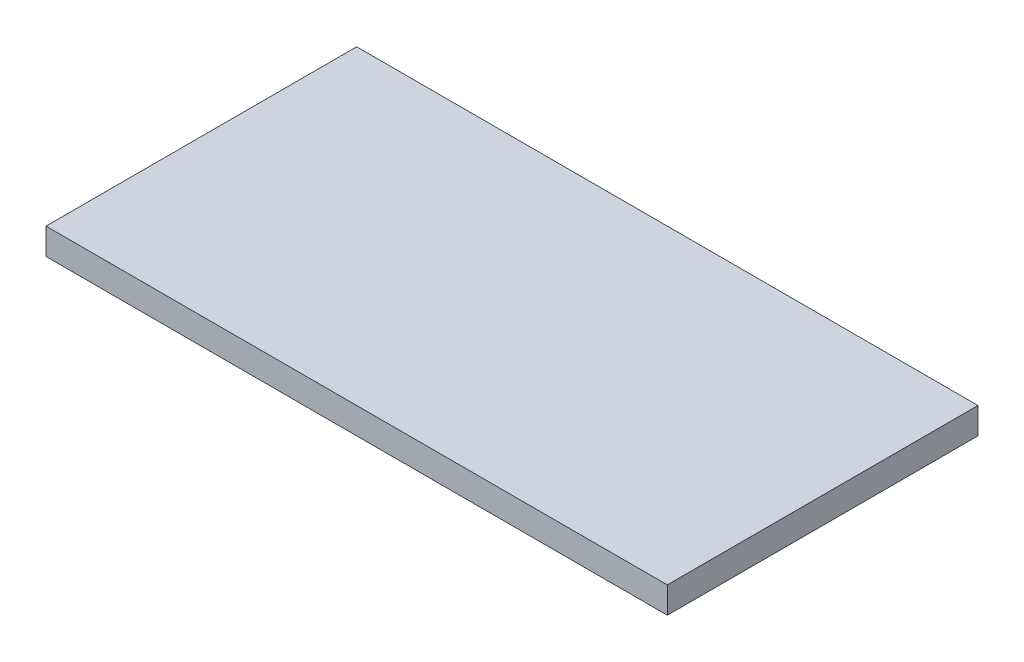
ISO-10303-21;
HEADER;
FILE_DESCRIPTION(('STEP AP214'),'2;1');
FILE_NAME('part.step','',(''),(''),'','','');
FILE_SCHEMA(('AUTOMOTIVE_DESIGN { 1 0 10303 214 1 1 1 1 }'));
ENDSEC;
DATA;
#1=APPLICATION_CONTEXT('core data for automotive mechanical design processes');
#2=APPLICATION_PROTOCOL_DEFINITION('international standard','automotive_design',2000,#1);
#3=PRODUCT_CONTEXT('',#1,'mechanical');
#4=PRODUCT('Part','Part','',(#3));
#5=PRODUCT_RELATED_PRODUCT_CATEGORY('part','',(#4));
#6=PRODUCT_DEFINITION_FORMATION('','',#4);
#7=PRODUCT_DEFINITION_CONTEXT('part definition',#1,'design');
#8=PRODUCT_DEFINITION('design','',#6,#7);
#9=PRODUCT_DEFINITION_SHAPE('','',#8);
#10=(LENGTH_UNIT() NAMED_UNIT(*) SI_UNIT(.MILLI.,.METRE.));
#11=(NAMED_UNIT(*) PLANE_ANGLE_UNIT() SI_UNIT($,.RADIAN.));
#12=(NAMED_UNIT(*) SI_UNIT($,.STERADIAN.) SOLID_ANGLE_UNIT());
#13=UNCERTAINTY_MEASURE_WITH_UNIT(LENGTH_MEASURE(1.E-05),#10,'distance_accuracy_value','');
#14=(GEOMETRIC_REPRESENTATION_CONTEXT(3) GLOBAL_UNCERTAINTY_ASSIGNED_CONTEXT((#13)) GLOBAL_UNIT_ASSIGNED_CONTEXT((#10,
#11,#12)) REPRESENTATION_CONTEXT('',''));
#15=CARTESIAN_POINT('',(0.,0.,0.));
#16=DIRECTION('',(0.,0.,1.));
#17=DIRECTION('',(1.,0.,0.));
#18=AXIS2_PLACEMENT_3D('',#15,#16,#17);
#19=CARTESIAN_POINT('',(0.,25.4,0.));
#20=DIRECTION('',(1.,0.,0.));
#21=DIRECTION('',(0.,0.,-1.));
#22=AXIS2_PLACEMENT_3D('',#19,#20,#21);
#23=PLANE('',#22);
#24=DIRECTION('',(0.,0.,1.));
#25=VECTOR('',#24,1.);
#26=CARTESIAN_POINT('',(0.,0.,0.));
#27=LINE('',#26,#25);
#28=CARTESIAN_POINT('',(0.,0.,-300.));
#29=VERTEX_POINT('',#28);
#30=CARTESIAN_POINT('',(0.,0.,0.));
#31=VERTEX_POINT('',#30);
#32=EDGE_CURVE('E111',#29,#31,#27,.T.);
#33=ORIENTED_EDGE('',*,*,#32,.T.);
#34=DIRECTION('',(0.,-1.,0.));
#35=VECTOR('',#34,1.);
#36=CARTESIAN_POINT('',(0.,25.4,0.));
#37=LINE('',#36,#35);
#38=CARTESIAN_POINT('',(0.,25.4,0.));
#39=VERTEX_POINT('',#38);
#40=EDGE_CURVE('E11',#39,#31,#37,.T.);
#41=ORIENTED_EDGE('',*,*,#40,.F.);
#42=DIRECTION('',(0.,0.,1.));
#43=VECTOR('',#42,1.);
#44=CARTESIAN_POINT('',(0.,25.4,0.));
#45=LINE('',#44,#43);
#46=CARTESIAN_POINT('',(0.,25.4,-300.));
#47=VERTEX_POINT('',#46);
#48=EDGE_CURVE('E95',#47,#39,#45,.T.);
#49=ORIENTED_EDGE('',*,*,#48,.F.);
#50=DIRECTION('',(0.,-1.,0.));
#51=VECTOR('',#50,1.);
#52=CARTESIAN_POINT('',(0.,25.4,-300.));
#53=LINE('',#52,#51);
#54=EDGE_CURVE('E107',#47,#29,#53,.T.);
#55=ORIENTED_EDGE('',*,*,#54,.T.);
#56=EDGE_LOOP('',(#33,#41,#49,#55));
#57=FACE_BOUND('',#56,.T.);
#58=ADVANCED_FACE('F43',(#57),#23,.F.);
#59=CARTESIAN_POINT('',(0.,25.4,0.));
#60=DIRECTION('',(0.,0.,-1.));
#61=DIRECTION('',(-1.,0.,0.));
#62=AXIS2_PLACEMENT_3D('',#59,#60,#61);
#63=PLANE('',#62);
#64=DIRECTION('',(1.,0.,0.));
#65=VECTOR('',#64,1.);
#66=CARTESIAN_POINT('',(0.,0.,0.));
#67=LINE('',#66,#65);
#68=CARTESIAN_POINT('',(600.,0.,0.));
#69=VERTEX_POINT('',#68);
#70=EDGE_CURVE('E100',#31,#69,#67,.T.);
#71=ORIENTED_EDGE('',*,*,#70,.T.);
#72=DIRECTION('',(0.,-1.,0.));
#73=VECTOR('',#72,1.);
#74=CARTESIAN_POINT('',(600.,25.4,0.));
#75=LINE('',#74,#73);
#76=CARTESIAN_POINT('',(600.,25.4,0.));
#77=VERTEX_POINT('',#76);
#78=EDGE_CURVE('E52',#77,#69,#75,.T.);
#79=ORIENTED_EDGE('',*,*,#78,.F.);
#80=DIRECTION('',(1.,0.,0.));
#81=VECTOR('',#80,1.);
#82=CARTESIAN_POINT('',(0.,25.4,0.));
#83=LINE('',#82,#81);
#84=EDGE_CURVE('E90',#39,#77,#83,.T.);
#85=ORIENTED_EDGE('',*,*,#84,.F.);
#86=ORIENTED_EDGE('',*,*,#40,.T.);
#87=EDGE_LOOP('',(#71,#79,#85,#86));
#88=FACE_BOUND('',#87,.T.);
#89=ADVANCED_FACE('F99',(#88),#63,.F.);
#90=CARTESIAN_POINT('',(600.,25.4,0.));
#91=DIRECTION('',(-1.,0.,0.));
#92=DIRECTION('',(0.,0.,1.));
#93=AXIS2_PLACEMENT_3D('',#90,#91,#92);
#94=PLANE('',#93);
#95=DIRECTION('',(0.,0.,-1.));
#96=VECTOR('',#95,1.);
#97=CARTESIAN_POINT('',(600.,0.,0.));
#98=LINE('',#97,#96);
#99=CARTESIAN_POINT('',(600.,0.,-300.));
#100=VERTEX_POINT('',#99);
#101=EDGE_CURVE('E77',#69,#100,#98,.T.);
#102=ORIENTED_EDGE('',*,*,#101,.T.);
#103=DIRECTION('',(0.,-1.,0.));
#104=VECTOR('',#103,1.);
#105=CARTESIAN_POINT('',(600.,25.4,-300.));
#106=LINE('',#105,#104);
#107=CARTESIAN_POINT('',(600.,25.4,-300.));
#108=VERTEX_POINT('',#107);
#109=EDGE_CURVE('E102',#108,#100,#106,.T.);
#110=ORIENTED_EDGE('',*,*,#109,.F.);
#111=DIRECTION('',(0.,0.,-1.));
#112=VECTOR('',#111,1.);
#113=CARTESIAN_POINT('',(600.,25.4,0.));
#114=LINE('',#113,#112);
#115=EDGE_CURVE('E93',#77,#108,#114,.T.);
#116=ORIENTED_EDGE('',*,*,#115,.F.);
#117=ORIENTED_EDGE('',*,*,#78,.T.);
#118=EDGE_LOOP('',(#102,#110,#116,#117));
#119=FACE_BOUND('',#118,.T.);
#120=ADVANCED_FACE('F103',(#119),#94,.F.);
#121=CARTESIAN_POINT('',(0.,25.4,-300.));
#122=DIRECTION('',(0.,0.,1.));
#123=DIRECTION('',(1.,0.,0.));
#124=AXIS2_PLACEMENT_3D('',#121,#122,#123);
#125=PLANE('',#124);
#126=DIRECTION('',(-1.,0.,0.));
#127=VECTOR('',#126,1.);
#128=CARTESIAN_POINT('',(0.,0.,-300.));
#129=LINE('',#128,#127);
#130=EDGE_CURVE('E83',#100,#29,#129,.T.);
#131=ORIENTED_EDGE('',*,*,#130,.T.);
#132=ORIENTED_EDGE('',*,*,#54,.F.);
#133=DIRECTION('',(-1.,0.,0.));
#134=VECTOR('',#133,1.);
#135=CARTESIAN_POINT('',(0.,25.4,-300.));
#136=LINE('',#135,#134);
#137=EDGE_CURVE('E60',#108,#47,#136,.T.);
#138=ORIENTED_EDGE('',*,*,#137,.F.);
#139=ORIENTED_EDGE('',*,*,#109,.T.);
#140=EDGE_LOOP('',(#131,#132,#138,#139));
#141=FACE_BOUND('',#140,.T.);
#142=ADVANCED_FACE('F124',(#141),#125,.F.);
#143=CARTESIAN_POINT('',(0.,25.4,0.));
#144=DIRECTION('',(0.,-1.,0.));
#145=DIRECTION('',(0.,0.,-1.));
#146=AXIS2_PLACEMENT_3D('',#143,#144,#145);
#147=PLANE('',#146);
#148=ORIENTED_EDGE('',*,*,#48,.T.);
#149=ORIENTED_EDGE('',*,*,#84,.T.);
#150=ORIENTED_EDGE('',*,*,#115,.T.);
#151=ORIENTED_EDGE('',*,*,#137,.T.);
#152=EDGE_LOOP('',(#148,#149,#150,#151));
#153=FACE_BOUND('',#152,.T.);
#154=ADVANCED_FACE('F91',(#153),#147,.F.);
#155=CARTESIAN_POINT('',(0.,0.,0.));
#156=DIRECTION('',(0.,-1.,0.));
#157=DIRECTION('',(0.,0.,-1.));
#158=AXIS2_PLACEMENT_3D('',#155,#156,#157);
#159=PLANE('',#158);
#160=ORIENTED_EDGE('',*,*,#32,.F.);
#161=ORIENTED_EDGE('',*,*,#130,.F.);
#162=ORIENTED_EDGE('',*,*,#101,.F.);
#163=ORIENTED_EDGE('',*,*,#70,.F.);
#164=EDGE_LOOP('',(#160,#161,#162,#163));
#165=FACE_BOUND('',#164,.T.);
#166=ADVANCED_FACE('F127',(#165),#159,.T.);
#167=CLOSED_SHELL('',(#58,#89,#120,#142,#154,#166));
#168=MANIFOLD_SOLID_BREP('B2',#167);
#169=ADVANCED_BREP_SHAPE_REPRESENTATION('',(#18,#168),#14);
#170=SHAPE_DEFINITION_REPRESENTATION(#9,#169);
ENDSEC;
END-ISO-10303-21;
